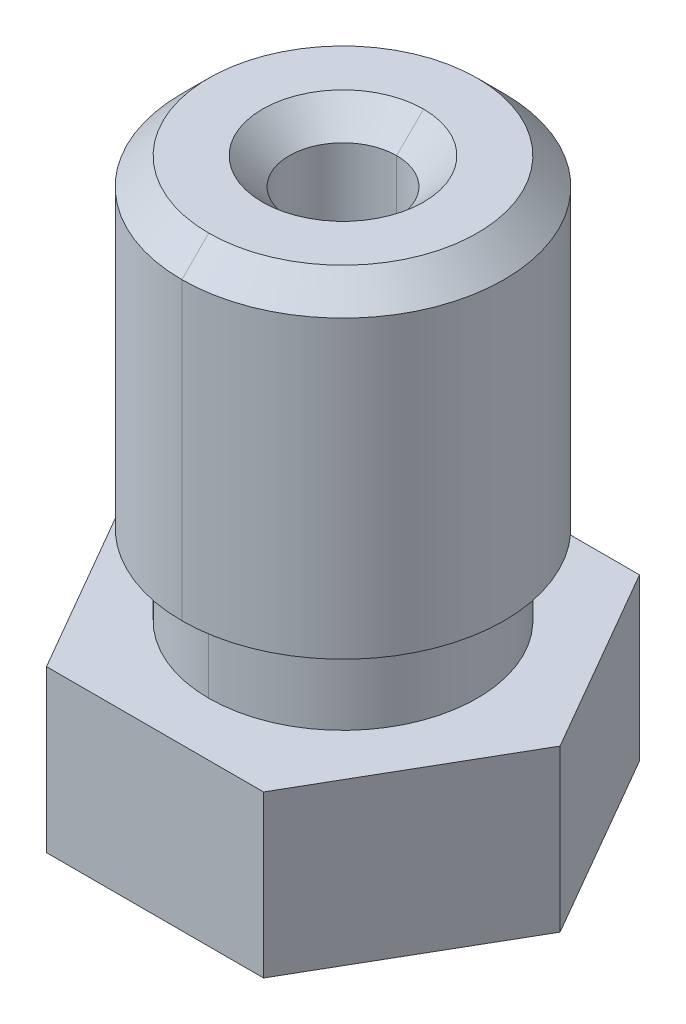
ISO-10303-21;
HEADER;
FILE_DESCRIPTION(('STEP AP214'),'2;1');
FILE_NAME('part.step','',(''),(''),'','','');
FILE_SCHEMA(('AUTOMOTIVE_DESIGN { 1 0 10303 214 1 1 1 1 }'));
ENDSEC;
DATA;
#1=APPLICATION_CONTEXT('core data for automotive mechanical design processes');
#2=APPLICATION_PROTOCOL_DEFINITION('international standard','automotive_design',2000,#1);
#3=PRODUCT_CONTEXT('',#1,'mechanical');
#4=PRODUCT('Part','Part','',(#3));
#5=PRODUCT_RELATED_PRODUCT_CATEGORY('part','',(#4));
#6=PRODUCT_DEFINITION_FORMATION('','',#4);
#7=PRODUCT_DEFINITION_CONTEXT('part definition',#1,'design');
#8=PRODUCT_DEFINITION('design','',#6,#7);
#9=PRODUCT_DEFINITION_SHAPE('','',#8);
#10=(LENGTH_UNIT() NAMED_UNIT(*) SI_UNIT(.MILLI.,.METRE.));
#11=(NAMED_UNIT(*) PLANE_ANGLE_UNIT() SI_UNIT($,.RADIAN.));
#12=(NAMED_UNIT(*) SI_UNIT($,.STERADIAN.) SOLID_ANGLE_UNIT());
#13=UNCERTAINTY_MEASURE_WITH_UNIT(LENGTH_MEASURE(1.E-05),#10,'distance_accuracy_value','');
#14=(GEOMETRIC_REPRESENTATION_CONTEXT(3) GLOBAL_UNCERTAINTY_ASSIGNED_CONTEXT((#13)) GLOBAL_UNIT_ASSIGNED_CONTEXT((#10,
#11,#12)) REPRESENTATION_CONTEXT('',''));
#15=CARTESIAN_POINT('',(0.,0.,0.));
#16=DIRECTION('',(0.,0.,1.));
#17=DIRECTION('',(1.,0.,0.));
#18=AXIS2_PLACEMENT_3D('',#15,#16,#17);
#19=CARTESIAN_POINT('',(0.,-0.227272727272729,0.));
#20=DIRECTION('',(0.,1.,0.));
#21=DIRECTION('',(0.,0.,1.));
#22=AXIS2_PLACEMENT_3D('',#19,#20,#21);
#23=CONICAL_SURFACE('',#22,0.75,0.832981266674432);
#24=CARTESIAN_POINT('',(0.,-0.227272727272729,0.));
#25=DIRECTION('',(0.,1.,0.));
#26=DIRECTION('',(0.,0.,1.));
#27=AXIS2_PLACEMENT_3D('',#24,#25,#26);
#28=CIRCLE('',#27,0.75);
#29=CARTESIAN_POINT('',(0.,-0.227272727272729,-0.75));
#30=VERTEX_POINT('',#29);
#31=CARTESIAN_POINT('',(0.,-0.227272727272729,0.75));
#32=VERTEX_POINT('',#31);
#33=EDGE_CURVE('E42',#30,#32,#28,.T.);
#34=ORIENTED_EDGE('',*,*,#33,.F.);
#35=DIRECTION('',(0.,0.672672793996312,-0.739940073395944));
#36=VECTOR('',#35,1.);
#37=CARTESIAN_POINT('',(0.,-0.227272727272729,-0.75));
#38=LINE('',#37,#36);
#39=CARTESIAN_POINT('',(0.,0.,-1.));
#40=VERTEX_POINT('',#39);
#41=EDGE_CURVE('E11',#30,#40,#38,.T.);
#42=ORIENTED_EDGE('',*,*,#41,.T.);
#43=CARTESIAN_POINT('',(0.,0.,0.));
#44=DIRECTION('',(0.,1.,0.));
#45=DIRECTION('',(0.,0.,1.));
#46=AXIS2_PLACEMENT_3D('',#43,#44,#45);
#47=CIRCLE('',#46,1.);
#48=CARTESIAN_POINT('',(0.,0.,1.));
#49=VERTEX_POINT('',#48);
#50=EDGE_CURVE('E28',#40,#49,#47,.T.);
#51=ORIENTED_EDGE('',*,*,#50,.T.);
#52=DIRECTION('',(0.,0.672672793996312,0.739940073395944));
#53=VECTOR('',#52,1.);
#54=CARTESIAN_POINT('',(0.,-0.227272727272729,0.75));
#55=LINE('',#54,#53);
#56=EDGE_CURVE('E276',#32,#49,#55,.T.);
#57=ORIENTED_EDGE('',*,*,#56,.F.);
#58=EDGE_LOOP('',(#34,#42,#51,#57));
#59=FACE_BOUND('',#58,.T.);
#60=ADVANCED_FACE('F17',(#59),#23,.F.);
#61=CARTESIAN_POINT('',(0.,3.,0.));
#62=DIRECTION('',(0.,1.,0.));
#63=DIRECTION('',(0.,0.,1.));
#64=AXIS2_PLACEMENT_3D('',#61,#62,#63);
#65=CYLINDRICAL_SURFACE('',#64,0.75);
#66=CARTESIAN_POINT('',(0.,-0.7,0.));
#67=DIRECTION('',(0.,1.,0.));
#68=DIRECTION('',(0.,0.,1.));
#69=AXIS2_PLACEMENT_3D('',#66,#67,#68);
#70=CIRCLE('',#69,0.75);
#71=CARTESIAN_POINT('',(0.,-0.7,-0.75));
#72=VERTEX_POINT('',#71);
#73=CARTESIAN_POINT('',(0.,-0.7,0.75));
#74=VERTEX_POINT('',#73);
#75=EDGE_CURVE('E208',#72,#74,#70,.T.);
#76=ORIENTED_EDGE('',*,*,#75,.F.);
#77=DIRECTION('',(0.,1.,0.));
#78=VECTOR('',#77,1.);
#79=CARTESIAN_POINT('',(0.,3.,-0.75));
#80=LINE('',#79,#78);
#81=EDGE_CURVE('E238',#72,#30,#80,.T.);
#82=ORIENTED_EDGE('',*,*,#81,.T.);
#83=ORIENTED_EDGE('',*,*,#33,.T.);
#84=DIRECTION('',(0.,1.,0.));
#85=VECTOR('',#84,1.);
#86=CARTESIAN_POINT('',(0.,3.,0.75));
#87=LINE('',#86,#85);
#88=EDGE_CURVE('E204',#74,#32,#87,.T.);
#89=ORIENTED_EDGE('',*,*,#88,.F.);
#90=EDGE_LOOP('',(#76,#82,#83,#89));
#91=FACE_BOUND('',#90,.T.);
#92=ADVANCED_FACE('F206',(#91),#65,.F.);
#93=CARTESIAN_POINT('',(0.,-1.2,0.));
#94=DIRECTION('',(0.,1.,0.));
#95=DIRECTION('',(0.,0.,1.));
#96=AXIS2_PLACEMENT_3D('',#93,#94,#95);
#97=CONICAL_SURFACE('',#96,0.2,0.832981266674432);
#98=CARTESIAN_POINT('',(0.,-1.2,0.));
#99=DIRECTION('',(0.,1.,0.));
#100=DIRECTION('',(0.,0.,1.));
#101=AXIS2_PLACEMENT_3D('',#98,#99,#100);
#102=CIRCLE('',#101,0.2);
#103=CARTESIAN_POINT('',(0.,-1.2,-0.2));
#104=VERTEX_POINT('',#103);
#105=CARTESIAN_POINT('',(0.,-1.2,0.2));
#106=VERTEX_POINT('',#105);
#107=EDGE_CURVE('E342',#104,#106,#102,.T.);
#108=ORIENTED_EDGE('',*,*,#107,.F.);
#109=DIRECTION('',(0.,0.672672793996313,-0.739940073395944));
#110=VECTOR('',#109,1.);
#111=CARTESIAN_POINT('',(0.,-1.2,-0.2));
#112=LINE('',#111,#110);
#113=EDGE_CURVE('E232',#104,#72,#112,.T.);
#114=ORIENTED_EDGE('',*,*,#113,.T.);
#115=ORIENTED_EDGE('',*,*,#75,.T.);
#116=DIRECTION('',(0.,0.672672793996313,0.739940073395944));
#117=VECTOR('',#116,1.);
#118=CARTESIAN_POINT('',(0.,-1.2,0.2));
#119=LINE('',#118,#117);
#120=EDGE_CURVE('E221',#106,#74,#119,.T.);
#121=ORIENTED_EDGE('',*,*,#120,.F.);
#122=EDGE_LOOP('',(#108,#114,#115,#121));
#123=FACE_BOUND('',#122,.T.);
#124=ADVANCED_FACE('F231',(#123),#97,.F.);
#125=CARTESIAN_POINT('',(0.,10.5,0.));
#126=DIRECTION('',(0.,-1.,0.));
#127=DIRECTION('',(0.,0.,-1.));
#128=AXIS2_PLACEMENT_3D('',#125,#126,#127);
#129=CONICAL_SURFACE('',#128,2.5,0.785398163397446);
#130=CARTESIAN_POINT('',(0.,10.5,0.));
#131=DIRECTION('',(0.,1.,0.));
#132=DIRECTION('',(0.,0.,-1.));
#133=AXIS2_PLACEMENT_3D('',#130,#131,#132);
#134=CIRCLE('',#133,2.5);
#135=CARTESIAN_POINT('',(0.,10.5,2.5));
#136=VERTEX_POINT('',#135);
#137=CARTESIAN_POINT('',(0.,10.5,-2.5));
#138=VERTEX_POINT('',#137);
#139=EDGE_CURVE('E369',#136,#138,#134,.T.);
#140=ORIENTED_EDGE('',*,*,#139,.F.);
#141=DIRECTION('',(0.,-0.707106781186549,0.707106781186546));
#142=VECTOR('',#141,1.);
#143=CARTESIAN_POINT('',(0.,10.5,2.5));
#144=LINE('',#143,#142);
#145=CARTESIAN_POINT('',(0.,10.,3.));
#146=VERTEX_POINT('',#145);
#147=EDGE_CURVE('E235',#136,#146,#144,.T.);
#148=ORIENTED_EDGE('',*,*,#147,.T.);
#149=CARTESIAN_POINT('',(0.,10.,0.));
#150=DIRECTION('',(0.,-1.,0.));
#151=DIRECTION('',(0.,0.,-1.));
#152=AXIS2_PLACEMENT_3D('',#149,#150,#151);
#153=CIRCLE('',#152,3.);
#154=CARTESIAN_POINT('',(0.,10.,-3.));
#155=VERTEX_POINT('',#154);
#156=EDGE_CURVE('E332',#155,#146,#153,.T.);
#157=ORIENTED_EDGE('',*,*,#156,.F.);
#158=DIRECTION('',(0.,-0.707106781186549,-0.707106781186546));
#159=VECTOR('',#158,1.);
#160=CARTESIAN_POINT('',(0.,10.5,-2.5));
#161=LINE('',#160,#159);
#162=EDGE_CURVE('E229',#138,#155,#161,.T.);
#163=ORIENTED_EDGE('',*,*,#162,.F.);
#164=EDGE_LOOP('',(#140,#148,#157,#163));
#165=FACE_BOUND('',#164,.T.);
#166=ADVANCED_FACE('F607',(#165),#129,.T.);
#167=CARTESIAN_POINT('',(0.,-2.,0.));
#168=DIRECTION('',(0.,1.,0.));
#169=DIRECTION('',(0.,0.,1.));
#170=AXIS2_PLACEMENT_3D('',#167,#168,#169);
#171=CONICAL_SURFACE('',#170,0.5,0.785398163397446);
#172=CARTESIAN_POINT('',(0.,-2.,0.));
#173=DIRECTION('',(0.,1.,0.));
#174=DIRECTION('',(0.,0.,1.));
#175=AXIS2_PLACEMENT_3D('',#172,#173,#174);
#176=CIRCLE('',#175,0.5);
#177=CARTESIAN_POINT('',(0.,-2.,0.5));
#178=VERTEX_POINT('',#177);
#179=CARTESIAN_POINT('',(0.,-2.,-0.5));
#180=VERTEX_POINT('',#179);
#181=EDGE_CURVE('E21',#178,#180,#176,.T.);
#182=ORIENTED_EDGE('',*,*,#181,.T.);
#183=DIRECTION('',(0.,0.707106781186549,-0.707106781186546));
#184=VECTOR('',#183,1.);
#185=CARTESIAN_POINT('',(0.,-2.,-0.5));
#186=LINE('',#185,#184);
#187=CARTESIAN_POINT('',(0.,0.,-2.5));
#188=VERTEX_POINT('',#187);
#189=EDGE_CURVE('E360',#180,#188,#186,.T.);
#190=ORIENTED_EDGE('',*,*,#189,.T.);
#191=CARTESIAN_POINT('',(0.,0.,0.));
#192=DIRECTION('',(0.,-1.,0.));
#193=DIRECTION('',(0.,0.,1.));
#194=AXIS2_PLACEMENT_3D('',#191,#192,#193);
#195=CIRCLE('',#194,2.5);
#196=CARTESIAN_POINT('',(0.,0.,2.5));
#197=VERTEX_POINT('',#196);
#198=EDGE_CURVE('E455',#188,#197,#195,.T.);
#199=ORIENTED_EDGE('',*,*,#198,.T.);
#200=DIRECTION('',(0.,0.707106781186549,0.707106781186546));
#201=VECTOR('',#200,1.);
#202=CARTESIAN_POINT('',(0.,-2.,0.5));
#203=LINE('',#202,#201);
#204=EDGE_CURVE('E399',#178,#197,#203,.T.);
#205=ORIENTED_EDGE('',*,*,#204,.F.);
#206=EDGE_LOOP('',(#182,#190,#199,#205));
#207=FACE_BOUND('',#206,.T.);
#208=ADVANCED_FACE('F611',(#207),#171,.T.);
#209=CARTESIAN_POINT('',(0.,3.,0.));
#210=DIRECTION('',(0.,1.,0.));
#211=DIRECTION('',(0.,0.,1.));
#212=AXIS2_PLACEMENT_3D('',#209,#210,#211);
#213=CYLINDRICAL_SURFACE('',#212,2.5);
#214=CARTESIAN_POINT('',(0.,3.,0.));
#215=DIRECTION('',(0.,1.,0.));
#216=DIRECTION('',(0.,0.,1.));
#217=AXIS2_PLACEMENT_3D('',#214,#215,#216);
#218=CIRCLE('',#217,2.5);
#219=CARTESIAN_POINT('',(0.,3.,2.5));
#220=VERTEX_POINT('',#219);
#221=CARTESIAN_POINT('',(0.,3.,-2.5));
#222=VERTEX_POINT('',#221);
#223=EDGE_CURVE('E270',#220,#222,#218,.T.);
#224=ORIENTED_EDGE('',*,*,#223,.T.);
#225=DIRECTION('',(0.,1.,0.));
#226=VECTOR('',#225,1.);
#227=CARTESIAN_POINT('',(0.,3.,-2.5));
#228=LINE('',#227,#226);
#229=CARTESIAN_POINT('',(0.,4.5,-2.5));
#230=VERTEX_POINT('',#229);
#231=EDGE_CURVE('E266',#222,#230,#228,.T.);
#232=ORIENTED_EDGE('',*,*,#231,.T.);
#233=CARTESIAN_POINT('',(0.,4.5,0.));
#234=DIRECTION('',(0.,1.,0.));
#235=DIRECTION('',(0.,0.,1.));
#236=AXIS2_PLACEMENT_3D('',#233,#234,#235);
#237=CIRCLE('',#236,2.5);
#238=CARTESIAN_POINT('',(0.,4.5,2.5));
#239=VERTEX_POINT('',#238);
#240=EDGE_CURVE('E389',#239,#230,#237,.T.);
#241=ORIENTED_EDGE('',*,*,#240,.F.);
#242=DIRECTION('',(0.,1.,0.));
#243=VECTOR('',#242,1.);
#244=CARTESIAN_POINT('',(0.,3.,2.5));
#245=LINE('',#244,#243);
#246=EDGE_CURVE('E100',#220,#239,#245,.T.);
#247=ORIENTED_EDGE('',*,*,#246,.F.);
#248=EDGE_LOOP('',(#224,#232,#241,#247));
#249=FACE_BOUND('',#248,.T.);
#250=ADVANCED_FACE('F654',(#249),#213,.T.);
#251=CARTESIAN_POINT('',(0.,3.,0.));
#252=DIRECTION('',(0.,1.,0.));
#253=DIRECTION('',(0.,0.,1.));
#254=AXIS2_PLACEMENT_3D('',#251,#252,#253);
#255=CYLINDRICAL_SURFACE('',#254,3.);
#256=CARTESIAN_POINT('',(0.,4.5,0.));
#257=DIRECTION('',(0.,1.,0.));
#258=DIRECTION('',(0.,0.,1.));
#259=AXIS2_PLACEMENT_3D('',#256,#257,#258);
#260=CIRCLE('',#259,3.);
#261=CARTESIAN_POINT('',(0.,4.5,3.));
#262=VERTEX_POINT('',#261);
#263=CARTESIAN_POINT('',(0.,4.5,-3.));
#264=VERTEX_POINT('',#263);
#265=EDGE_CURVE('E271',#262,#264,#260,.T.);
#266=ORIENTED_EDGE('',*,*,#265,.T.);
#267=DIRECTION('',(0.,1.,0.));
#268=VECTOR('',#267,1.);
#269=CARTESIAN_POINT('',(0.,3.,-3.));
#270=LINE('',#269,#268);
#271=EDGE_CURVE('E336',#264,#155,#270,.T.);
#272=ORIENTED_EDGE('',*,*,#271,.T.);
#273=ORIENTED_EDGE('',*,*,#156,.T.);
#274=DIRECTION('',(0.,1.,0.));
#275=VECTOR('',#274,1.);
#276=CARTESIAN_POINT('',(0.,3.,3.));
#277=LINE('',#276,#275);
#278=EDGE_CURVE('E309',#262,#146,#277,.T.);
#279=ORIENTED_EDGE('',*,*,#278,.F.);
#280=EDGE_LOOP('',(#266,#272,#273,#279));
#281=FACE_BOUND('',#280,.T.);
#282=ADVANCED_FACE('F770',(#281),#255,.T.);
#283=CARTESIAN_POINT('',(0.,10.5,0.));
#284=DIRECTION('',(0.,1.,0.));
#285=DIRECTION('',(0.,0.,1.));
#286=AXIS2_PLACEMENT_3D('',#283,#284,#285);
#287=CONICAL_SURFACE('',#286,1.5,0.785398163397446);
#288=CARTESIAN_POINT('',(0.,10.,0.));
#289=DIRECTION('',(0.,1.,0.));
#290=DIRECTION('',(0.,0.,1.));
#291=AXIS2_PLACEMENT_3D('',#288,#289,#290);
#292=CIRCLE('',#291,1.);
#293=CARTESIAN_POINT('',(0.,10.,-1.));
#294=VERTEX_POINT('',#293);
#295=CARTESIAN_POINT('',(0.,10.,1.));
#296=VERTEX_POINT('',#295);
#297=EDGE_CURVE('E252',#294,#296,#292,.T.);
#298=ORIENTED_EDGE('',*,*,#297,.F.);
#299=DIRECTION('',(0.,0.707106781186549,-0.707106781186546));
#300=VECTOR('',#299,1.);
#301=CARTESIAN_POINT('',(0.,10.5,-1.5));
#302=LINE('',#301,#300);
#303=CARTESIAN_POINT('',(0.,10.5,-1.5));
#304=VERTEX_POINT('',#303);
#305=EDGE_CURVE('E337',#294,#304,#302,.T.);
#306=ORIENTED_EDGE('',*,*,#305,.T.);
#307=CARTESIAN_POINT('',(0.,10.5,0.));
#308=DIRECTION('',(0.,1.,0.));
#309=DIRECTION('',(0.,0.,1.));
#310=AXIS2_PLACEMENT_3D('',#307,#308,#309);
#311=CIRCLE('',#310,1.5);
#312=CARTESIAN_POINT('',(0.,10.5,1.5));
#313=VERTEX_POINT('',#312);
#314=EDGE_CURVE('E376',#304,#313,#311,.T.);
#315=ORIENTED_EDGE('',*,*,#314,.T.);
#316=DIRECTION('',(0.,0.707106781186549,0.707106781186546));
#317=VECTOR('',#316,1.);
#318=CARTESIAN_POINT('',(0.,10.5,1.5));
#319=LINE('',#318,#317);
#320=EDGE_CURVE('E281',#296,#313,#319,.T.);
#321=ORIENTED_EDGE('',*,*,#320,.F.);
#322=EDGE_LOOP('',(#298,#306,#315,#321));
#323=FACE_BOUND('',#322,.T.);
#324=ADVANCED_FACE('F746',(#323),#287,.F.);
#325=CARTESIAN_POINT('',(0.,3.,0.));
#326=DIRECTION('',(0.,-1.,0.));
#327=DIRECTION('',(0.,0.,-1.));
#328=AXIS2_PLACEMENT_3D('',#325,#326,#327);
#329=CYLINDRICAL_SURFACE('',#328,1.);
#330=ORIENTED_EDGE('',*,*,#297,.T.);
#331=DIRECTION('',(0.,-1.,0.));
#332=VECTOR('',#331,1.);
#333=CARTESIAN_POINT('',(0.,3.,1.));
#334=LINE('',#333,#332);
#335=EDGE_CURVE('E249',#296,#49,#334,.T.);
#336=ORIENTED_EDGE('',*,*,#335,.T.);
#337=ORIENTED_EDGE('',*,*,#50,.F.);
#338=DIRECTION('',(0.,-1.,0.));
#339=VECTOR('',#338,1.);
#340=CARTESIAN_POINT('',(0.,3.,-1.));
#341=LINE('',#340,#339);
#342=EDGE_CURVE('E289',#294,#40,#341,.T.);
#343=ORIENTED_EDGE('',*,*,#342,.F.);
#344=EDGE_LOOP('',(#330,#336,#337,#343));
#345=FACE_BOUND('',#344,.T.);
#346=ADVANCED_FACE('F591',(#345),#329,.F.);
#347=CARTESIAN_POINT('',(0.,3.,0.));
#348=DIRECTION('',(0.,1.,0.));
#349=DIRECTION('',(0.,0.,1.));
#350=AXIS2_PLACEMENT_3D('',#347,#348,#349);
#351=CYLINDRICAL_SURFACE('',#350,0.2);
#352=CARTESIAN_POINT('',(0.,-2.,0.));
#353=DIRECTION('',(0.,1.,0.));
#354=DIRECTION('',(0.,0.,1.));
#355=AXIS2_PLACEMENT_3D('',#352,#353,#354);
#356=CIRCLE('',#355,0.2);
#357=CARTESIAN_POINT('',(0.,-2.,-0.2));
#358=VERTEX_POINT('',#357);
#359=CARTESIAN_POINT('',(0.,-2.,0.2));
#360=VERTEX_POINT('',#359);
#361=EDGE_CURVE('E371',#358,#360,#356,.T.);
#362=ORIENTED_EDGE('',*,*,#361,.F.);
#363=DIRECTION('',(0.,1.,0.));
#364=VECTOR('',#363,1.);
#365=CARTESIAN_POINT('',(0.,3.,-0.2));
#366=LINE('',#365,#364);
#367=EDGE_CURVE('E253',#358,#104,#366,.T.);
#368=ORIENTED_EDGE('',*,*,#367,.T.);
#369=ORIENTED_EDGE('',*,*,#107,.T.);
#370=DIRECTION('',(0.,1.,0.));
#371=VECTOR('',#370,1.);
#372=CARTESIAN_POINT('',(0.,3.,0.2));
#373=LINE('',#372,#371);
#374=EDGE_CURVE('E303',#360,#106,#373,.T.);
#375=ORIENTED_EDGE('',*,*,#374,.F.);
#376=EDGE_LOOP('',(#362,#368,#369,#375));
#377=FACE_BOUND('',#376,.T.);
#378=ADVANCED_FACE('F586',(#377),#351,.F.);
#379=CARTESIAN_POINT('',(0.,3.,0.));
#380=DIRECTION('',(0.,1.,0.));
#381=DIRECTION('',(0.,0.,1.));
#382=AXIS2_PLACEMENT_3D('',#379,#380,#381);
#383=CYLINDRICAL_SURFACE('',#382,0.2);
#384=ORIENTED_EDGE('',*,*,#367,.F.);
#385=CARTESIAN_POINT('',(0.,-2.,0.));
#386=DIRECTION('',(0.,1.,0.));
#387=DIRECTION('',(0.,0.,1.));
#388=AXIS2_PLACEMENT_3D('',#385,#386,#387);
#389=CIRCLE('',#388,0.2);
#390=EDGE_CURVE('E373',#360,#358,#389,.T.);
#391=ORIENTED_EDGE('',*,*,#390,.F.);
#392=ORIENTED_EDGE('',*,*,#374,.T.);
#393=CARTESIAN_POINT('',(0.,-1.2,0.));
#394=DIRECTION('',(0.,1.,0.));
#395=DIRECTION('',(0.,0.,1.));
#396=AXIS2_PLACEMENT_3D('',#393,#394,#395);
#397=CIRCLE('',#396,0.2);
#398=EDGE_CURVE('E225',#106,#104,#397,.T.);
#399=ORIENTED_EDGE('',*,*,#398,.T.);
#400=EDGE_LOOP('',(#384,#391,#392,#399));
#401=FACE_BOUND('',#400,.T.);
#402=ADVANCED_FACE('F590',(#401),#383,.F.);
#403=CARTESIAN_POINT('',(0.,0.,0.));
#404=DIRECTION('',(0.,1.,0.));
#405=DIRECTION('',(1.,0.,0.));
#406=AXIS2_PLACEMENT_3D('',#403,#404,#405);
#407=PLANE('',#406);
#408=DIRECTION('',(1.,0.,0.));
#409=VECTOR('',#408,1.);
#410=CARTESIAN_POINT('',(-2.02072594216369,0.,3.5));
#411=LINE('',#410,#409);
#412=CARTESIAN_POINT('',(-2.02072594216369,0.,3.5));
#413=VERTEX_POINT('',#412);
#414=CARTESIAN_POINT('',(2.02072594216369,0.,3.5));
#415=VERTEX_POINT('',#414);
#416=EDGE_CURVE('E419',#413,#415,#411,.T.);
#417=ORIENTED_EDGE('',*,*,#416,.F.);
#418=DIRECTION('',(0.5,0.,0.866025403784439));
#419=VECTOR('',#418,1.);
#420=CARTESIAN_POINT('',(-4.04145188432738,0.,0.));
#421=LINE('',#420,#419);
#422=CARTESIAN_POINT('',(-4.04145188432738,0.,0.));
#423=VERTEX_POINT('',#422);
#424=EDGE_CURVE('E290',#423,#413,#421,.T.);
#425=ORIENTED_EDGE('',*,*,#424,.F.);
#426=DIRECTION('',(-0.5,0.,0.866025403784439));
#427=VECTOR('',#426,1.);
#428=CARTESIAN_POINT('',(-2.02072594216369,0.,-3.5));
#429=LINE('',#428,#427);
#430=CARTESIAN_POINT('',(-2.02072594216369,0.,-3.5));
#431=VERTEX_POINT('',#430);
#432=EDGE_CURVE('E321',#431,#423,#429,.T.);
#433=ORIENTED_EDGE('',*,*,#432,.F.);
#434=DIRECTION('',(-1.,0.,0.));
#435=VECTOR('',#434,1.);
#436=CARTESIAN_POINT('',(2.02072594216368,0.,-3.5));
#437=LINE('',#436,#435);
#438=CARTESIAN_POINT('',(2.02072594216368,0.,-3.5));
#439=VERTEX_POINT('',#438);
#440=EDGE_CURVE('E258',#439,#431,#437,.T.);
#441=ORIENTED_EDGE('',*,*,#440,.F.);
#442=DIRECTION('',(-0.5,0.,-0.866025403784438));
#443=VECTOR('',#442,1.);
#444=CARTESIAN_POINT('',(4.04145188432738,0.,0.));
#445=LINE('',#444,#443);
#446=CARTESIAN_POINT('',(4.04145188432738,0.,0.));
#447=VERTEX_POINT('',#446);
#448=EDGE_CURVE('E247',#447,#439,#445,.T.);
#449=ORIENTED_EDGE('',*,*,#448,.F.);
#450=DIRECTION('',(0.5,0.,-0.866025403784439));
#451=VECTOR('',#450,1.);
#452=CARTESIAN_POINT('',(2.02072594216369,0.,3.5));
#453=LINE('',#452,#451);
#454=EDGE_CURVE('E295',#415,#447,#453,.T.);
#455=ORIENTED_EDGE('',*,*,#454,.F.);
#456=EDGE_LOOP('',(#417,#425,#433,#441,#449,#455));
#457=FACE_BOUND('',#456,.T.);
#458=CARTESIAN_POINT('',(0.,0.,0.));
#459=DIRECTION('',(0.,-1.,0.));
#460=DIRECTION('',(0.,0.,1.));
#461=AXIS2_PLACEMENT_3D('',#458,#459,#460);
#462=CIRCLE('',#461,2.5);
#463=EDGE_CURVE('E339',#197,#188,#462,.T.);
#464=ORIENTED_EDGE('',*,*,#463,.F.);
#465=ORIENTED_EDGE('',*,*,#198,.F.);
#466=EDGE_LOOP('',(#464,#465));
#467=FACE_BOUND('',#466,.T.);
#468=ADVANCED_FACE('F483',(#457,#467),#407,.F.);
#469=CARTESIAN_POINT('',(0.,3.,0.));
#470=DIRECTION('',(0.,1.,0.));
#471=DIRECTION('',(1.,0.,0.));
#472=AXIS2_PLACEMENT_3D('',#469,#470,#471);
#473=PLANE('',#472);
#474=DIRECTION('',(1.,0.,0.));
#475=VECTOR('',#474,1.);
#476=CARTESIAN_POINT('',(-2.02072594216369,3.,3.5));
#477=LINE('',#476,#475);
#478=CARTESIAN_POINT('',(-2.02072594216369,3.,3.5));
#479=VERTEX_POINT('',#478);
#480=CARTESIAN_POINT('',(2.02072594216369,3.,3.5));
#481=VERTEX_POINT('',#480);
#482=EDGE_CURVE('E304',#479,#481,#477,.T.);
#483=ORIENTED_EDGE('',*,*,#482,.T.);
#484=DIRECTION('',(0.5,0.,-0.866025403784439));
#485=VECTOR('',#484,1.);
#486=CARTESIAN_POINT('',(2.02072594216369,3.,3.5));
#487=LINE('',#486,#485);
#488=CARTESIAN_POINT('',(4.04145188432738,3.,0.));
#489=VERTEX_POINT('',#488);
#490=EDGE_CURVE('E308',#481,#489,#487,.T.);
#491=ORIENTED_EDGE('',*,*,#490,.T.);
#492=DIRECTION('',(-0.5,0.,-0.866025403784438));
#493=VECTOR('',#492,1.);
#494=CARTESIAN_POINT('',(4.04145188432738,3.,0.));
#495=LINE('',#494,#493);
#496=CARTESIAN_POINT('',(2.02072594216368,3.,-3.5));
#497=VERTEX_POINT('',#496);
#498=EDGE_CURVE('E327',#489,#497,#495,.T.);
#499=ORIENTED_EDGE('',*,*,#498,.T.);
#500=DIRECTION('',(-1.,0.,0.));
#501=VECTOR('',#500,1.);
#502=CARTESIAN_POINT('',(2.02072594216368,3.,-3.5));
#503=LINE('',#502,#501);
#504=CARTESIAN_POINT('',(-2.02072594216369,3.,-3.5));
#505=VERTEX_POINT('',#504);
#506=EDGE_CURVE('E331',#497,#505,#503,.T.);
#507=ORIENTED_EDGE('',*,*,#506,.T.);
#508=DIRECTION('',(-0.5,0.,0.866025403784439));
#509=VECTOR('',#508,1.);
#510=CARTESIAN_POINT('',(-2.02072594216369,3.,-3.5));
#511=LINE('',#510,#509);
#512=CARTESIAN_POINT('',(-4.04145188432738,3.,0.));
#513=VERTEX_POINT('',#512);
#514=EDGE_CURVE('E418',#505,#513,#511,.T.);
#515=ORIENTED_EDGE('',*,*,#514,.T.);
#516=DIRECTION('',(0.5,0.,0.866025403784439));
#517=VECTOR('',#516,1.);
#518=CARTESIAN_POINT('',(-4.04145188432738,3.,0.));
#519=LINE('',#518,#517);
#520=EDGE_CURVE('E415',#513,#479,#519,.T.);
#521=ORIENTED_EDGE('',*,*,#520,.T.);
#522=EDGE_LOOP('',(#483,#491,#499,#507,#515,#521));
#523=FACE_BOUND('',#522,.T.);
#524=ORIENTED_EDGE('',*,*,#223,.F.);
#525=CARTESIAN_POINT('',(0.,3.,0.));
#526=DIRECTION('',(0.,1.,0.));
#527=DIRECTION('',(0.,0.,1.));
#528=AXIS2_PLACEMENT_3D('',#525,#526,#527);
#529=CIRCLE('',#528,2.5);
#530=EDGE_CURVE('E385',#222,#220,#529,.T.);
#531=ORIENTED_EDGE('',*,*,#530,.F.);
#532=EDGE_LOOP('',(#524,#531));
#533=FACE_BOUND('',#532,.T.);
#534=ADVANCED_FACE('F477',(#523,#533),#473,.T.);
#535=CARTESIAN_POINT('',(-2.02072594216369,3.,3.5));
#536=DIRECTION('',(0.,0.,-1.));
#537=DIRECTION('',(0.,-1.,0.));
#538=AXIS2_PLACEMENT_3D('',#535,#536,#537);
#539=PLANE('',#538);
#540=ORIENTED_EDGE('',*,*,#416,.T.);
#541=DIRECTION('',(0.,-1.,0.));
#542=VECTOR('',#541,1.);
#543=CARTESIAN_POINT('',(2.02072594216369,3.,3.5));
#544=LINE('',#543,#542);
#545=EDGE_CURVE('E300',#481,#415,#544,.T.);
#546=ORIENTED_EDGE('',*,*,#545,.F.);
#547=ORIENTED_EDGE('',*,*,#482,.F.);
#548=DIRECTION('',(0.,-1.,0.));
#549=VECTOR('',#548,1.);
#550=CARTESIAN_POINT('',(-2.02072594216369,3.,3.5));
#551=LINE('',#550,#549);
#552=EDGE_CURVE('E299',#479,#413,#551,.T.);
#553=ORIENTED_EDGE('',*,*,#552,.T.);
#554=EDGE_LOOP('',(#540,#546,#547,#553));
#555=FACE_BOUND('',#554,.T.);
#556=ADVANCED_FACE('F624',(#555),#539,.F.);
#557=CARTESIAN_POINT('',(2.02072594216369,3.,3.5));
#558=DIRECTION('',(-0.866025403784439,0.,-0.5));
#559=DIRECTION('',(-0.5,0.,0.866025403784439));
#560=AXIS2_PLACEMENT_3D('',#557,#558,#559);
#561=PLANE('',#560);
#562=ORIENTED_EDGE('',*,*,#454,.T.);
#563=DIRECTION('',(0.,-1.,0.));
#564=VECTOR('',#563,1.);
#565=CARTESIAN_POINT('',(4.04145188432738,3.,0.));
#566=LINE('',#565,#564);
#567=EDGE_CURVE('E254',#489,#447,#566,.T.);
#568=ORIENTED_EDGE('',*,*,#567,.F.);
#569=ORIENTED_EDGE('',*,*,#490,.F.);
#570=ORIENTED_EDGE('',*,*,#545,.T.);
#571=EDGE_LOOP('',(#562,#568,#569,#570));
#572=FACE_BOUND('',#571,.T.);
#573=ADVANCED_FACE('F628',(#572),#561,.F.);
#574=CARTESIAN_POINT('',(4.04145188432738,3.,0.));
#575=DIRECTION('',(-0.866025403784438,0.,0.5));
#576=DIRECTION('',(0.,1.,0.));
#577=AXIS2_PLACEMENT_3D('',#574,#575,#576);
#578=PLANE('',#577);
#579=ORIENTED_EDGE('',*,*,#448,.T.);
#580=DIRECTION('',(0.,-1.,0.));
#581=VECTOR('',#580,1.);
#582=CARTESIAN_POINT('',(2.02072594216368,3.,-3.5));
#583=LINE('',#582,#581);
#584=EDGE_CURVE('E262',#497,#439,#583,.T.);
#585=ORIENTED_EDGE('',*,*,#584,.F.);
#586=ORIENTED_EDGE('',*,*,#498,.F.);
#587=ORIENTED_EDGE('',*,*,#567,.T.);
#588=EDGE_LOOP('',(#579,#585,#586,#587));
#589=FACE_BOUND('',#588,.T.);
#590=ADVANCED_FACE('F486',(#589),#578,.F.);
#591=CARTESIAN_POINT('',(2.02072594216368,3.,-3.5));
#592=DIRECTION('',(0.,0.,1.));
#593=DIRECTION('',(1.,0.,0.));
#594=AXIS2_PLACEMENT_3D('',#591,#592,#593);
#595=PLANE('',#594);
#596=ORIENTED_EDGE('',*,*,#440,.T.);
#597=DIRECTION('',(0.,-1.,0.));
#598=VECTOR('',#597,1.);
#599=CARTESIAN_POINT('',(-2.02072594216369,3.,-3.5));
#600=LINE('',#599,#598);
#601=EDGE_CURVE('E293',#505,#431,#600,.T.);
#602=ORIENTED_EDGE('',*,*,#601,.F.);
#603=ORIENTED_EDGE('',*,*,#506,.F.);
#604=ORIENTED_EDGE('',*,*,#584,.T.);
#605=EDGE_LOOP('',(#596,#602,#603,#604));
#606=FACE_BOUND('',#605,.T.);
#607=ADVANCED_FACE('F481',(#606),#595,.F.);
#608=CARTESIAN_POINT('',(-2.02072594216369,3.,-3.5));
#609=DIRECTION('',(0.866025403784439,0.,0.5));
#610=DIRECTION('',(0.,-1.,0.));
#611=AXIS2_PLACEMENT_3D('',#608,#609,#610);
#612=PLANE('',#611);
#613=ORIENTED_EDGE('',*,*,#432,.T.);
#614=DIRECTION('',(0.,-1.,0.));
#615=VECTOR('',#614,1.);
#616=CARTESIAN_POINT('',(-4.04145188432738,3.,0.));
#617=LINE('',#616,#615);
#618=EDGE_CURVE('E294',#513,#423,#617,.T.);
#619=ORIENTED_EDGE('',*,*,#618,.F.);
#620=ORIENTED_EDGE('',*,*,#514,.F.);
#621=ORIENTED_EDGE('',*,*,#601,.T.);
#622=EDGE_LOOP('',(#613,#619,#620,#621));
#623=FACE_BOUND('',#622,.T.);
#624=ADVANCED_FACE('F435',(#623),#612,.F.);
#625=CARTESIAN_POINT('',(-4.04145188432738,3.,0.));
#626=DIRECTION('',(0.866025403784439,0.,-0.5));
#627=DIRECTION('',(0.,-1.,0.));
#628=AXIS2_PLACEMENT_3D('',#625,#626,#627);
#629=PLANE('',#628);
#630=ORIENTED_EDGE('',*,*,#424,.T.);
#631=ORIENTED_EDGE('',*,*,#552,.F.);
#632=ORIENTED_EDGE('',*,*,#520,.F.);
#633=ORIENTED_EDGE('',*,*,#618,.T.);
#634=EDGE_LOOP('',(#630,#631,#632,#633));
#635=FACE_BOUND('',#634,.T.);
#636=ADVANCED_FACE('F428',(#635),#629,.F.);
#637=CARTESIAN_POINT('',(0.,3.,0.));
#638=DIRECTION('',(0.,-1.,0.));
#639=DIRECTION('',(0.,0.,-1.));
#640=AXIS2_PLACEMENT_3D('',#637,#638,#639);
#641=CYLINDRICAL_SURFACE('',#640,1.);
#642=ORIENTED_EDGE('',*,*,#335,.F.);
#643=CARTESIAN_POINT('',(0.,10.,0.));
#644=DIRECTION('',(0.,1.,0.));
#645=DIRECTION('',(0.,0.,1.));
#646=AXIS2_PLACEMENT_3D('',#643,#644,#645);
#647=CIRCLE('',#646,1.);
#648=EDGE_CURVE('E326',#296,#294,#647,.T.);
#649=ORIENTED_EDGE('',*,*,#648,.T.);
#650=ORIENTED_EDGE('',*,*,#342,.T.);
#651=CARTESIAN_POINT('',(0.,0.,0.));
#652=DIRECTION('',(0.,1.,0.));
#653=DIRECTION('',(0.,0.,1.));
#654=AXIS2_PLACEMENT_3D('',#651,#652,#653);
#655=CIRCLE('',#654,1.);
#656=EDGE_CURVE('E272',#49,#40,#655,.T.);
#657=ORIENTED_EDGE('',*,*,#656,.F.);
#658=EDGE_LOOP('',(#642,#649,#650,#657));
#659=FACE_BOUND('',#658,.T.);
#660=ADVANCED_FACE('F706',(#659),#641,.F.);
#661=CARTESIAN_POINT('',(0.,10.5,0.));
#662=DIRECTION('',(0.,1.,0.));
#663=DIRECTION('',(0.,0.,1.));
#664=AXIS2_PLACEMENT_3D('',#661,#662,#663);
#665=CONICAL_SURFACE('',#664,1.5,0.785398163397446);
#666=ORIENTED_EDGE('',*,*,#305,.F.);
#667=ORIENTED_EDGE('',*,*,#648,.F.);
#668=ORIENTED_EDGE('',*,*,#320,.T.);
#669=CARTESIAN_POINT('',(0.,10.5,0.));
#670=DIRECTION('',(0.,1.,0.));
#671=DIRECTION('',(0.,0.,1.));
#672=AXIS2_PLACEMENT_3D('',#669,#670,#671);
#673=CIRCLE('',#672,1.5);
#674=EDGE_CURVE('E277',#313,#304,#673,.T.);
#675=ORIENTED_EDGE('',*,*,#674,.T.);
#676=EDGE_LOOP('',(#666,#667,#668,#675));
#677=FACE_BOUND('',#676,.T.);
#678=ADVANCED_FACE('F601',(#677),#665,.F.);
#679=CARTESIAN_POINT('',(1.5,10.5,0.));
#680=DIRECTION('',(0.,-1.,0.));
#681=DIRECTION('',(0.,0.,-1.));
#682=AXIS2_PLACEMENT_3D('',#679,#680,#681);
#683=PLANE('',#682);
#684=CARTESIAN_POINT('',(0.,10.5,0.));
#685=DIRECTION('',(0.,1.,0.));
#686=DIRECTION('',(0.,0.,-1.));
#687=AXIS2_PLACEMENT_3D('',#684,#685,#686);
#688=CIRCLE('',#687,2.5);
#689=EDGE_CURVE('E282',#138,#136,#688,.T.);
#690=ORIENTED_EDGE('',*,*,#689,.T.);
#691=ORIENTED_EDGE('',*,*,#139,.T.);
#692=EDGE_LOOP('',(#690,#691));
#693=FACE_BOUND('',#692,.T.);
#694=ORIENTED_EDGE('',*,*,#674,.F.);
#695=ORIENTED_EDGE('',*,*,#314,.F.);
#696=EDGE_LOOP('',(#694,#695));
#697=FACE_BOUND('',#696,.T.);
#698=ADVANCED_FACE('F596',(#693,#697),#683,.F.);
#699=CARTESIAN_POINT('',(0.,3.,0.));
#700=DIRECTION('',(0.,1.,0.));
#701=DIRECTION('',(0.,0.,1.));
#702=AXIS2_PLACEMENT_3D('',#699,#700,#701);
#703=CYLINDRICAL_SURFACE('',#702,3.);
#704=ORIENTED_EDGE('',*,*,#271,.F.);
#705=CARTESIAN_POINT('',(0.,4.5,0.));
#706=DIRECTION('',(0.,1.,0.));
#707=DIRECTION('',(0.,0.,1.));
#708=AXIS2_PLACEMENT_3D('',#705,#706,#707);
#709=CIRCLE('',#708,3.);
#710=EDGE_CURVE('E313',#264,#262,#709,.T.);
#711=ORIENTED_EDGE('',*,*,#710,.T.);
#712=ORIENTED_EDGE('',*,*,#278,.T.);
#713=CARTESIAN_POINT('',(0.,10.,0.));
#714=DIRECTION('',(0.,-1.,0.));
#715=DIRECTION('',(0.,0.,-1.));
#716=AXIS2_PLACEMENT_3D('',#713,#714,#715);
#717=CIRCLE('',#716,3.);
#718=EDGE_CURVE('E314',#146,#155,#717,.T.);
#719=ORIENTED_EDGE('',*,*,#718,.T.);
#720=EDGE_LOOP('',(#704,#711,#712,#719));
#721=FACE_BOUND('',#720,.T.);
#722=ADVANCED_FACE('F600',(#721),#703,.T.);
#723=CARTESIAN_POINT('',(3.,4.5,0.));
#724=DIRECTION('',(0.,1.,0.));
#725=DIRECTION('',(1.,0.,0.));
#726=AXIS2_PLACEMENT_3D('',#723,#724,#725);
#727=PLANE('',#726);
#728=ORIENTED_EDGE('',*,*,#265,.F.);
#729=ORIENTED_EDGE('',*,*,#710,.F.);
#730=EDGE_LOOP('',(#728,#729));
#731=FACE_BOUND('',#730,.T.);
#732=ORIENTED_EDGE('',*,*,#240,.T.);
#733=CARTESIAN_POINT('',(0.,4.5,0.));
#734=DIRECTION('',(0.,1.,0.));
#735=DIRECTION('',(0.,0.,1.));
#736=AXIS2_PLACEMENT_3D('',#733,#734,#735);
#737=CIRCLE('',#736,2.5);
#738=EDGE_CURVE('E390',#230,#239,#737,.T.);
#739=ORIENTED_EDGE('',*,*,#738,.T.);
#740=EDGE_LOOP('',(#732,#739));
#741=FACE_BOUND('',#740,.T.);
#742=ADVANCED_FACE('F634',(#731,#741),#727,.F.);
#743=CARTESIAN_POINT('',(0.,3.,0.));
#744=DIRECTION('',(0.,1.,0.));
#745=DIRECTION('',(0.,0.,1.));
#746=AXIS2_PLACEMENT_3D('',#743,#744,#745);
#747=CYLINDRICAL_SURFACE('',#746,2.5);
#748=ORIENTED_EDGE('',*,*,#231,.F.);
#749=ORIENTED_EDGE('',*,*,#530,.T.);
#750=ORIENTED_EDGE('',*,*,#246,.T.);
#751=ORIENTED_EDGE('',*,*,#738,.F.);
#752=EDGE_LOOP('',(#748,#749,#750,#751));
#753=FACE_BOUND('',#752,.T.);
#754=ADVANCED_FACE('F638',(#753),#747,.T.);
#755=CARTESIAN_POINT('',(0.2,-2.,0.));
#756=DIRECTION('',(0.,1.,0.));
#757=DIRECTION('',(1.,0.,0.));
#758=AXIS2_PLACEMENT_3D('',#755,#756,#757);
#759=PLANE('',#758);
#760=ORIENTED_EDGE('',*,*,#181,.F.);
#761=CARTESIAN_POINT('',(0.,-2.,0.));
#762=DIRECTION('',(0.,1.,0.));
#763=DIRECTION('',(0.,0.,1.));
#764=AXIS2_PLACEMENT_3D('',#761,#762,#763);
#765=CIRCLE('',#764,0.5);
#766=EDGE_CURVE('E374',#180,#178,#765,.T.);
#767=ORIENTED_EDGE('',*,*,#766,.F.);
#768=EDGE_LOOP('',(#760,#767));
#769=FACE_BOUND('',#768,.T.);
#770=ORIENTED_EDGE('',*,*,#390,.T.);
#771=ORIENTED_EDGE('',*,*,#361,.T.);
#772=EDGE_LOOP('',(#770,#771));
#773=FACE_BOUND('',#772,.T.);
#774=ADVANCED_FACE('F580',(#769,#773),#759,.F.);
#775=CARTESIAN_POINT('',(0.,-2.,0.));
#776=DIRECTION('',(0.,1.,0.));
#777=DIRECTION('',(0.,0.,1.));
#778=AXIS2_PLACEMENT_3D('',#775,#776,#777);
#779=CONICAL_SURFACE('',#778,0.5,0.785398163397446);
#780=ORIENTED_EDGE('',*,*,#189,.F.);
#781=ORIENTED_EDGE('',*,*,#766,.T.);
#782=ORIENTED_EDGE('',*,*,#204,.T.);
#783=ORIENTED_EDGE('',*,*,#463,.T.);
#784=EDGE_LOOP('',(#780,#781,#782,#783));
#785=FACE_BOUND('',#784,.T.);
#786=ADVANCED_FACE('F575',(#785),#779,.T.);
#787=CARTESIAN_POINT('',(0.,10.5,0.));
#788=DIRECTION('',(0.,-1.,0.));
#789=DIRECTION('',(0.,0.,-1.));
#790=AXIS2_PLACEMENT_3D('',#787,#788,#789);
#791=CONICAL_SURFACE('',#790,2.5,0.785398163397446);
#792=ORIENTED_EDGE('',*,*,#147,.F.);
#793=ORIENTED_EDGE('',*,*,#689,.F.);
#794=ORIENTED_EDGE('',*,*,#162,.T.);
#795=ORIENTED_EDGE('',*,*,#718,.F.);
#796=EDGE_LOOP('',(#792,#793,#794,#795));
#797=FACE_BOUND('',#796,.T.);
#798=ADVANCED_FACE('F579',(#797),#791,.T.);
#799=CARTESIAN_POINT('',(0.,-1.2,0.));
#800=DIRECTION('',(0.,1.,0.));
#801=DIRECTION('',(0.,0.,1.));
#802=AXIS2_PLACEMENT_3D('',#799,#800,#801);
#803=CONICAL_SURFACE('',#802,0.2,0.832981266674432);
#804=ORIENTED_EDGE('',*,*,#113,.F.);
#805=ORIENTED_EDGE('',*,*,#398,.F.);
#806=ORIENTED_EDGE('',*,*,#120,.T.);
#807=CARTESIAN_POINT('',(0.,-0.7,0.));
#808=DIRECTION('',(0.,1.,0.));
#809=DIRECTION('',(0.,0.,1.));
#810=AXIS2_PLACEMENT_3D('',#807,#808,#809);
#811=CIRCLE('',#810,0.75);
#812=EDGE_CURVE('E215',#74,#72,#811,.T.);
#813=ORIENTED_EDGE('',*,*,#812,.T.);
#814=EDGE_LOOP('',(#804,#805,#806,#813));
#815=FACE_BOUND('',#814,.T.);
#816=ADVANCED_FACE('F223',(#815),#803,.F.);
#817=CARTESIAN_POINT('',(0.,3.,0.));
#818=DIRECTION('',(0.,1.,0.));
#819=DIRECTION('',(0.,0.,1.));
#820=AXIS2_PLACEMENT_3D('',#817,#818,#819);
#821=CYLINDRICAL_SURFACE('',#820,0.75);
#822=ORIENTED_EDGE('',*,*,#81,.F.);
#823=ORIENTED_EDGE('',*,*,#812,.F.);
#824=ORIENTED_EDGE('',*,*,#88,.T.);
#825=CARTESIAN_POINT('',(0.,-0.227272727272729,0.));
#826=DIRECTION('',(0.,1.,0.));
#827=DIRECTION('',(0.,0.,1.));
#828=AXIS2_PLACEMENT_3D('',#825,#826,#827);
#829=CIRCLE('',#828,0.75);
#830=EDGE_CURVE('E216',#32,#30,#829,.T.);
#831=ORIENTED_EDGE('',*,*,#830,.T.);
#832=EDGE_LOOP('',(#822,#823,#824,#831));
#833=FACE_BOUND('',#832,.T.);
#834=ADVANCED_FACE('F237',(#833),#821,.F.);
#835=CARTESIAN_POINT('',(0.,-0.227272727272729,0.));
#836=DIRECTION('',(0.,1.,0.));
#837=DIRECTION('',(0.,0.,1.));
#838=AXIS2_PLACEMENT_3D('',#835,#836,#837);
#839=CONICAL_SURFACE('',#838,0.75,0.832981266674432);
#840=ORIENTED_EDGE('',*,*,#41,.F.);
#841=ORIENTED_EDGE('',*,*,#830,.F.);
#842=ORIENTED_EDGE('',*,*,#56,.T.);
#843=ORIENTED_EDGE('',*,*,#656,.T.);
#844=EDGE_LOOP('',(#840,#841,#842,#843));
#845=FACE_BOUND('',#844,.T.);
#846=ADVANCED_FACE('F19',(#845),#839,.F.);
#847=CLOSED_SHELL('',(#60,#92,#124,#166,#208,#250,#282,#324,#346,#378,#402,#468,#534,#556,#573,
#590,#607,#624,#636,#660,#678,#698,#722,#742,#754,#774,#786,#798,#816,#834,#846));
#848=MANIFOLD_SOLID_BREP('B1',#847);
#849=ADVANCED_BREP_SHAPE_REPRESENTATION('',(#18,#848),#14);
#850=SHAPE_DEFINITION_REPRESENTATION(#9,#849);
ENDSEC;
END-ISO-10303-21;
